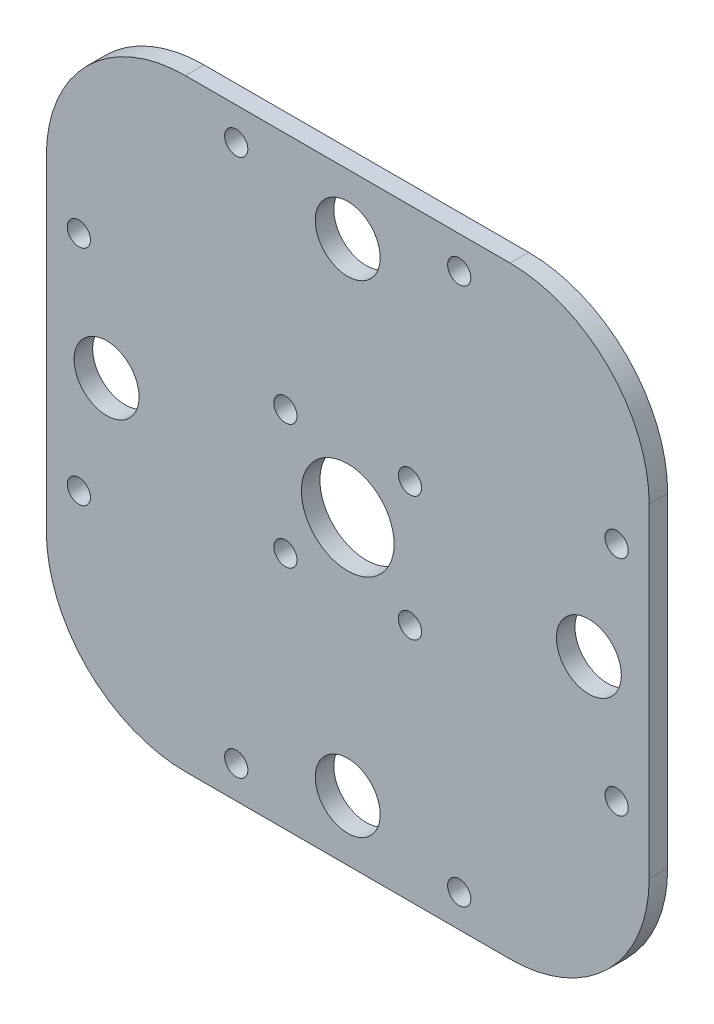
ISO-10303-21;
HEADER;
FILE_DESCRIPTION(('STEP AP214'),'2;1');
FILE_NAME('part.step','',(''),(''),'','','');
FILE_SCHEMA(('AUTOMOTIVE_DESIGN { 1 0 10303 214 1 1 1 1 }'));
ENDSEC;
DATA;
#1=APPLICATION_CONTEXT('core data for automotive mechanical design processes');
#2=APPLICATION_PROTOCOL_DEFINITION('international standard','automotive_design',2000,#1);
#3=PRODUCT_CONTEXT('',#1,'mechanical');
#4=PRODUCT('Part','Part','',(#3));
#5=PRODUCT_RELATED_PRODUCT_CATEGORY('part','',(#4));
#6=PRODUCT_DEFINITION_FORMATION('','',#4);
#7=PRODUCT_DEFINITION_CONTEXT('part definition',#1,'design');
#8=PRODUCT_DEFINITION('design','',#6,#7);
#9=PRODUCT_DEFINITION_SHAPE('','',#8);
#10=(LENGTH_UNIT() NAMED_UNIT(*) SI_UNIT(.MILLI.,.METRE.));
#11=(NAMED_UNIT(*) PLANE_ANGLE_UNIT() SI_UNIT($,.RADIAN.));
#12=(NAMED_UNIT(*) SI_UNIT($,.STERADIAN.) SOLID_ANGLE_UNIT());
#13=UNCERTAINTY_MEASURE_WITH_UNIT(LENGTH_MEASURE(1.E-05),#10,'distance_accuracy_value','');
#14=(GEOMETRIC_REPRESENTATION_CONTEXT(3) GLOBAL_UNCERTAINTY_ASSIGNED_CONTEXT((#13)) GLOBAL_UNIT_ASSIGNED_CONTEXT((#10,
#11,#12)) REPRESENTATION_CONTEXT('',''));
#15=CARTESIAN_POINT('',(0.,0.,0.));
#16=DIRECTION('',(0.,0.,1.));
#17=DIRECTION('',(1.,0.,0.));
#18=AXIS2_PLACEMENT_3D('',#15,#16,#17);
#19=CARTESIAN_POINT('',(0.,0.,2.));
#20=DIRECTION('',(0.,0.,-1.));
#21=DIRECTION('',(-1.,0.,0.));
#22=AXIS2_PLACEMENT_3D('',#19,#20,#21);
#23=PLANE('',#22);
#24=CARTESIAN_POINT('',(-12.0208152801713,28.9913780286485,2.));
#25=DIRECTION('',(0.,0.,1.));
#26=DIRECTION('',(-1.,0.,0.));
#27=AXIS2_PLACEMENT_3D('',#24,#25,#26);
#28=CIRCLE('',#27,1.25);
#29=CARTESIAN_POINT('',(-13.2708152801713,28.9913780286485,2.));
#30=VERTEX_POINT('',#29);
#31=EDGE_CURVE('E255',#30,#30,#28,.T.);
#32=ORIENTED_EDGE('',*,*,#31,.F.);
#33=EDGE_LOOP('',(#32));
#34=FACE_BOUND('',#33,.T.);
#35=CARTESIAN_POINT('',(12.0208152801708,28.9913780286496,2.));
#36=DIRECTION('',(0.,0.,1.));
#37=DIRECTION('',(1.,0.,0.));
#38=AXIS2_PLACEMENT_3D('',#35,#36,#37);
#39=CIRCLE('',#38,1.25);
#40=CARTESIAN_POINT('',(13.2708152801708,28.9913780286496,2.));
#41=VERTEX_POINT('',#40);
#42=EDGE_CURVE('E249',#41,#41,#39,.T.);
#43=ORIENTED_EDGE('',*,*,#42,.F.);
#44=EDGE_LOOP('',(#43));
#45=FACE_BOUND('',#44,.T.);
#46=CARTESIAN_POINT('',(28.991378028648,12.0208152801725,2.));
#47=DIRECTION('',(0.,0.,1.));
#48=DIRECTION('',(-1.,0.,0.));
#49=AXIS2_PLACEMENT_3D('',#46,#47,#48);
#50=CIRCLE('',#49,1.25);
#51=CARTESIAN_POINT('',(27.741378028648,12.0208152801725,2.));
#52=VERTEX_POINT('',#51);
#53=EDGE_CURVE('E243',#52,#52,#50,.T.);
#54=ORIENTED_EDGE('',*,*,#53,.F.);
#55=EDGE_LOOP('',(#54));
#56=FACE_BOUND('',#55,.T.);
#57=CARTESIAN_POINT('',(28.9913780286492,-12.0208152801697,2.));
#58=DIRECTION('',(0.,0.,1.));
#59=DIRECTION('',(1.,0.,0.));
#60=AXIS2_PLACEMENT_3D('',#57,#58,#59);
#61=CIRCLE('',#60,1.25);
#62=CARTESIAN_POINT('',(30.2413780286492,-12.0208152801697,2.));
#63=VERTEX_POINT('',#62);
#64=EDGE_CURVE('E236',#63,#63,#61,.T.);
#65=ORIENTED_EDGE('',*,*,#64,.F.);
#66=EDGE_LOOP('',(#65));
#67=FACE_BOUND('',#66,.T.);
#68=CARTESIAN_POINT('',(12.020815280172,-28.9913780286469,2.));
#69=DIRECTION('',(0.,0.,1.));
#70=DIRECTION('',(-1.,0.,0.));
#71=AXIS2_PLACEMENT_3D('',#68,#69,#70);
#72=CIRCLE('',#71,1.25);
#73=CARTESIAN_POINT('',(10.770815280172,-28.9913780286469,2.));
#74=VERTEX_POINT('',#73);
#75=EDGE_CURVE('E272',#74,#74,#72,.T.);
#76=ORIENTED_EDGE('',*,*,#75,.F.);
#77=EDGE_LOOP('',(#76));
#78=FACE_BOUND('',#77,.T.);
#79=CARTESIAN_POINT('',(-12.0208152801702,-28.991378028648,2.));
#80=DIRECTION('',(0.,0.,1.));
#81=DIRECTION('',(1.,0.,0.));
#82=AXIS2_PLACEMENT_3D('',#79,#80,#81);
#83=CIRCLE('',#82,1.25);
#84=CARTESIAN_POINT('',(-10.7708152801702,-28.991378028648,2.));
#85=VERTEX_POINT('',#84);
#86=EDGE_CURVE('E266',#85,#85,#83,.T.);
#87=ORIENTED_EDGE('',*,*,#86,.F.);
#88=EDGE_LOOP('',(#87));
#89=FACE_BOUND('',#88,.T.);
#90=CARTESIAN_POINT('',(-28.9913780286473,-12.0208152801708,2.));
#91=DIRECTION('',(0.,0.,1.));
#92=DIRECTION('',(-1.,0.,0.));
#93=AXIS2_PLACEMENT_3D('',#90,#91,#92);
#94=CIRCLE('',#93,1.25);
#95=CARTESIAN_POINT('',(-30.2413780286473,-12.0208152801708,2.));
#96=VERTEX_POINT('',#95);
#97=EDGE_CURVE('E260',#96,#96,#94,.T.);
#98=ORIENTED_EDGE('',*,*,#97,.F.);
#99=EDGE_LOOP('',(#98));
#100=FACE_BOUND('',#99,.T.);
#101=CARTESIAN_POINT('',(-28.9913780286485,12.0208152801713,2.));
#102=DIRECTION('',(0.,0.,1.));
#103=DIRECTION('',(1.,0.,0.));
#104=AXIS2_PLACEMENT_3D('',#101,#102,#103);
#105=CIRCLE('',#104,1.25);
#106=CARTESIAN_POINT('',(-27.7413780286485,12.0208152801713,2.));
#107=VERTEX_POINT('',#106);
#108=EDGE_CURVE('E230',#107,#107,#105,.T.);
#109=ORIENTED_EDGE('',*,*,#108,.F.);
#110=EDGE_LOOP('',(#109));
#111=FACE_BOUND('',#110,.T.);
#112=CARTESIAN_POINT('',(-26.,-5.56479514318364E-13,2.));
#113=DIRECTION('',(0.,0.,1.));
#114=DIRECTION('',(1.,0.,0.));
#115=AXIS2_PLACEMENT_3D('',#112,#113,#114);
#116=CIRCLE('',#115,3.5);
#117=CARTESIAN_POINT('',(-22.5,-5.56479514318364E-13,2.));
#118=VERTEX_POINT('',#117);
#119=EDGE_CURVE('E225',#118,#118,#116,.T.);
#120=ORIENTED_EDGE('',*,*,#119,.F.);
#121=EDGE_LOOP('',(#120));
#122=FACE_BOUND('',#121,.T.);
#123=CARTESIAN_POINT('',(-5.58071555157255E-13,26.,2.));
#124=DIRECTION('',(0.,0.,1.));
#125=DIRECTION('',(1.,0.,0.));
#126=AXIS2_PLACEMENT_3D('',#123,#124,#125);
#127=CIRCLE('',#126,3.5);
#128=CARTESIAN_POINT('',(3.49999999999944,26.,2.));
#129=VERTEX_POINT('',#128);
#130=EDGE_CURVE('E219',#129,#129,#127,.T.);
#131=ORIENTED_EDGE('',*,*,#130,.F.);
#132=EDGE_LOOP('',(#131));
#133=FACE_BOUND('',#132,.T.);
#134=CARTESIAN_POINT('',(26.,5.59663595996147E-13,2.));
#135=DIRECTION('',(0.,0.,1.));
#136=DIRECTION('',(1.,0.,0.));
#137=AXIS2_PLACEMENT_3D('',#134,#135,#136);
#138=CIRCLE('',#137,3.5);
#139=CARTESIAN_POINT('',(29.5,5.59663595996147E-13,2.));
#140=VERTEX_POINT('',#139);
#141=EDGE_CURVE('E213',#140,#140,#138,.T.);
#142=ORIENTED_EDGE('',*,*,#141,.F.);
#143=EDGE_LOOP('',(#142));
#144=FACE_BOUND('',#143,.T.);
#145=CARTESIAN_POINT('',(5.61255636835038E-13,-26.,2.));
#146=DIRECTION('',(0.,0.,1.));
#147=DIRECTION('',(1.,0.,0.));
#148=AXIS2_PLACEMENT_3D('',#145,#146,#147);
#149=CIRCLE('',#148,3.5);
#150=CARTESIAN_POINT('',(3.50000000000056,-26.,2.));
#151=VERTEX_POINT('',#150);
#152=EDGE_CURVE('E206',#151,#151,#149,.T.);
#153=ORIENTED_EDGE('',*,*,#152,.F.);
#154=EDGE_LOOP('',(#153));
#155=FACE_BOUND('',#154,.T.);
#156=DIRECTION('',(0.,1.,0.));
#157=VECTOR('',#156,1.);
#158=CARTESIAN_POINT('',(32.5,-32.5,2.));
#159=LINE('',#158,#157);
#160=CARTESIAN_POINT('',(32.5,-17.5,2.));
#161=VERTEX_POINT('',#160);
#162=CARTESIAN_POINT('',(32.5,17.5,2.));
#163=VERTEX_POINT('',#162);
#164=EDGE_CURVE('E136',#161,#163,#159,.T.);
#165=ORIENTED_EDGE('',*,*,#164,.T.);
#166=CARTESIAN_POINT('',(17.5,17.5,2.));
#167=DIRECTION('',(0.,0.,-1.));
#168=DIRECTION('',(-1.,0.,0.));
#169=AXIS2_PLACEMENT_3D('',#166,#167,#168);
#170=CIRCLE('',#169,15.);
#171=CARTESIAN_POINT('',(17.5,32.5,2.));
#172=VERTEX_POINT('',#171);
#173=EDGE_CURVE('E151',#163,#172,#170,.F.);
#174=ORIENTED_EDGE('',*,*,#173,.T.);
#175=DIRECTION('',(-1.,0.,0.));
#176=VECTOR('',#175,1.);
#177=CARTESIAN_POINT('',(-32.5,32.5,2.));
#178=LINE('',#177,#176);
#179=CARTESIAN_POINT('',(-17.5,32.5,2.));
#180=VERTEX_POINT('',#179);
#181=EDGE_CURVE('E118',#172,#180,#178,.T.);
#182=ORIENTED_EDGE('',*,*,#181,.T.);
#183=CARTESIAN_POINT('',(-17.5,17.5,2.));
#184=DIRECTION('',(0.,0.,-1.));
#185=DIRECTION('',(-1.,0.,0.));
#186=AXIS2_PLACEMENT_3D('',#183,#184,#185);
#187=CIRCLE('',#186,15.);
#188=CARTESIAN_POINT('',(-32.5,17.5,2.));
#189=VERTEX_POINT('',#188);
#190=EDGE_CURVE('E146',#180,#189,#187,.F.);
#191=ORIENTED_EDGE('',*,*,#190,.T.);
#192=DIRECTION('',(0.,-1.,0.));
#193=VECTOR('',#192,1.);
#194=CARTESIAN_POINT('',(-32.5,-32.5,2.));
#195=LINE('',#194,#193);
#196=CARTESIAN_POINT('',(-32.5,-17.5,2.));
#197=VERTEX_POINT('',#196);
#198=EDGE_CURVE('E162',#189,#197,#195,.T.);
#199=ORIENTED_EDGE('',*,*,#198,.T.);
#200=CARTESIAN_POINT('',(-17.5,-17.5,2.));
#201=DIRECTION('',(0.,0.,-1.));
#202=DIRECTION('',(-1.,0.,0.));
#203=AXIS2_PLACEMENT_3D('',#200,#201,#202);
#204=CIRCLE('',#203,15.);
#205=CARTESIAN_POINT('',(-17.5,-32.5,2.));
#206=VERTEX_POINT('',#205);
#207=EDGE_CURVE('E54',#197,#206,#204,.F.);
#208=ORIENTED_EDGE('',*,*,#207,.T.);
#209=DIRECTION('',(1.,0.,0.));
#210=VECTOR('',#209,1.);
#211=CARTESIAN_POINT('',(-32.5,-32.5,2.));
#212=LINE('',#211,#210);
#213=CARTESIAN_POINT('',(17.5,-32.5,2.));
#214=VERTEX_POINT('',#213);
#215=EDGE_CURVE('E137',#206,#214,#212,.T.);
#216=ORIENTED_EDGE('',*,*,#215,.T.);
#217=CARTESIAN_POINT('',(17.5,-17.5,2.));
#218=DIRECTION('',(0.,0.,-1.));
#219=DIRECTION('',(-1.,0.,0.));
#220=AXIS2_PLACEMENT_3D('',#217,#218,#219);
#221=CIRCLE('',#220,15.);
#222=EDGE_CURVE('E149',#214,#161,#221,.F.);
#223=ORIENTED_EDGE('',*,*,#222,.T.);
#224=EDGE_LOOP('',(#165,#174,#182,#191,#199,#208,#216,#223));
#225=FACE_BOUND('',#224,.T.);
#226=CARTESIAN_POINT('',(-6.7175144212722,6.7175144212722,2.));
#227=DIRECTION('',(0.,0.,1.));
#228=DIRECTION('',(1.,0.,0.));
#229=AXIS2_PLACEMENT_3D('',#226,#227,#228);
#230=CIRCLE('',#229,1.25);
#231=CARTESIAN_POINT('',(-5.4675144212722,6.7175144212722,2.));
#232=VERTEX_POINT('',#231);
#233=EDGE_CURVE('E131',#232,#232,#230,.T.);
#234=ORIENTED_EDGE('',*,*,#233,.F.);
#235=EDGE_LOOP('',(#234));
#236=FACE_BOUND('',#235,.T.);
#237=CARTESIAN_POINT('',(6.7175144212722,6.71751442127258,2.));
#238=DIRECTION('',(0.,0.,1.));
#239=DIRECTION('',(1.,0.,0.));
#240=AXIS2_PLACEMENT_3D('',#237,#238,#239);
#241=CIRCLE('',#240,1.25);
#242=CARTESIAN_POINT('',(7.9675144212722,6.71751442127258,2.));
#243=VERTEX_POINT('',#242);
#244=EDGE_CURVE('E179',#243,#243,#241,.T.);
#245=ORIENTED_EDGE('',*,*,#244,.F.);
#246=EDGE_LOOP('',(#245));
#247=FACE_BOUND('',#246,.T.);
#248=CARTESIAN_POINT('',(0.,0.,2.));
#249=DIRECTION('',(0.,0.,1.));
#250=DIRECTION('',(1.,0.,0.));
#251=AXIS2_PLACEMENT_3D('',#248,#249,#250);
#252=CIRCLE('',#251,5.);
#253=CARTESIAN_POINT('',(4.99999999999999,0.,2.));
#254=VERTEX_POINT('',#253);
#255=EDGE_CURVE('E185',#254,#254,#252,.T.);
#256=ORIENTED_EDGE('',*,*,#255,.F.);
#257=EDGE_LOOP('',(#256));
#258=FACE_BOUND('',#257,.T.);
#259=CARTESIAN_POINT('',(6.71751442127258,-6.71751442127182,2.));
#260=DIRECTION('',(0.,0.,1.));
#261=DIRECTION('',(1.,0.,0.));
#262=AXIS2_PLACEMENT_3D('',#259,#260,#261);
#263=CIRCLE('',#262,1.25);
#264=CARTESIAN_POINT('',(7.96751442127258,-6.71751442127182,2.));
#265=VERTEX_POINT('',#264);
#266=EDGE_CURVE('E191',#265,#265,#263,.T.);
#267=ORIENTED_EDGE('',*,*,#266,.F.);
#268=EDGE_LOOP('',(#267));
#269=FACE_BOUND('',#268,.T.);
#270=CARTESIAN_POINT('',(-6.71751442127182,-6.7175144212722,2.));
#271=DIRECTION('',(0.,0.,1.));
#272=DIRECTION('',(1.,0.,0.));
#273=AXIS2_PLACEMENT_3D('',#270,#271,#272);
#274=CIRCLE('',#273,1.25);
#275=CARTESIAN_POINT('',(-5.46751442127182,-6.7175144212722,2.));
#276=VERTEX_POINT('',#275);
#277=EDGE_CURVE('E197',#276,#276,#274,.T.);
#278=ORIENTED_EDGE('',*,*,#277,.F.);
#279=EDGE_LOOP('',(#278));
#280=FACE_BOUND('',#279,.T.);
#281=ADVANCED_FACE('F32',(#34,#45,#56,#67,#78,#89,#100,#111,#122,#133,#144,#155,#225,#236,#247,
#258,#269,#280),#23,.F.);
#282=CARTESIAN_POINT('',(0.,0.,0.));
#283=DIRECTION('',(0.,0.,-1.));
#284=DIRECTION('',(-1.,0.,0.));
#285=AXIS2_PLACEMENT_3D('',#282,#283,#284);
#286=PLANE('',#285);
#287=CARTESIAN_POINT('',(-12.0208152801713,28.9913780286485,0.));
#288=DIRECTION('',(0.,0.,1.));
#289=DIRECTION('',(-1.,0.,0.));
#290=AXIS2_PLACEMENT_3D('',#287,#288,#289);
#291=CIRCLE('',#290,1.25);
#292=CARTESIAN_POINT('',(-13.2708152801713,28.9913780286485,0.));
#293=VERTEX_POINT('',#292);
#294=EDGE_CURVE('E233',#293,#293,#291,.T.);
#295=ORIENTED_EDGE('',*,*,#294,.T.);
#296=EDGE_LOOP('',(#295));
#297=FACE_BOUND('',#296,.T.);
#298=CARTESIAN_POINT('',(12.0208152801708,28.9913780286496,0.));
#299=DIRECTION('',(0.,0.,1.));
#300=DIRECTION('',(1.,0.,0.));
#301=AXIS2_PLACEMENT_3D('',#298,#299,#300);
#302=CIRCLE('',#301,1.25);
#303=CARTESIAN_POINT('',(13.2708152801708,28.9913780286496,0.));
#304=VERTEX_POINT('',#303);
#305=EDGE_CURVE('E252',#304,#304,#302,.T.);
#306=ORIENTED_EDGE('',*,*,#305,.T.);
#307=EDGE_LOOP('',(#306));
#308=FACE_BOUND('',#307,.T.);
#309=CARTESIAN_POINT('',(28.991378028648,12.0208152801725,0.));
#310=DIRECTION('',(0.,0.,1.));
#311=DIRECTION('',(-1.,0.,0.));
#312=AXIS2_PLACEMENT_3D('',#309,#310,#311);
#313=CIRCLE('',#312,1.25);
#314=CARTESIAN_POINT('',(27.741378028648,12.0208152801725,0.));
#315=VERTEX_POINT('',#314);
#316=EDGE_CURVE('E246',#315,#315,#313,.T.);
#317=ORIENTED_EDGE('',*,*,#316,.T.);
#318=EDGE_LOOP('',(#317));
#319=FACE_BOUND('',#318,.T.);
#320=CARTESIAN_POINT('',(28.9913780286492,-12.0208152801697,0.));
#321=DIRECTION('',(0.,0.,1.));
#322=DIRECTION('',(1.,0.,0.));
#323=AXIS2_PLACEMENT_3D('',#320,#321,#322);
#324=CIRCLE('',#323,1.25);
#325=CARTESIAN_POINT('',(30.2413780286492,-12.0208152801697,0.));
#326=VERTEX_POINT('',#325);
#327=EDGE_CURVE('E239',#326,#326,#324,.T.);
#328=ORIENTED_EDGE('',*,*,#327,.T.);
#329=EDGE_LOOP('',(#328));
#330=FACE_BOUND('',#329,.T.);
#331=CARTESIAN_POINT('',(12.020815280172,-28.9913780286469,0.));
#332=DIRECTION('',(0.,0.,1.));
#333=DIRECTION('',(-1.,0.,0.));
#334=AXIS2_PLACEMENT_3D('',#331,#332,#333);
#335=CIRCLE('',#334,1.25);
#336=CARTESIAN_POINT('',(10.770815280172,-28.9913780286469,0.));
#337=VERTEX_POINT('',#336);
#338=EDGE_CURVE('E240',#337,#337,#335,.T.);
#339=ORIENTED_EDGE('',*,*,#338,.T.);
#340=EDGE_LOOP('',(#339));
#341=FACE_BOUND('',#340,.T.);
#342=CARTESIAN_POINT('',(-12.0208152801702,-28.991378028648,0.));
#343=DIRECTION('',(0.,0.,1.));
#344=DIRECTION('',(1.,0.,0.));
#345=AXIS2_PLACEMENT_3D('',#342,#343,#344);
#346=CIRCLE('',#345,1.25);
#347=CARTESIAN_POINT('',(-10.7708152801702,-28.991378028648,0.));
#348=VERTEX_POINT('',#347);
#349=EDGE_CURVE('E269',#348,#348,#346,.T.);
#350=ORIENTED_EDGE('',*,*,#349,.T.);
#351=EDGE_LOOP('',(#350));
#352=FACE_BOUND('',#351,.T.);
#353=CARTESIAN_POINT('',(-28.9913780286473,-12.0208152801708,0.));
#354=DIRECTION('',(0.,0.,1.));
#355=DIRECTION('',(-1.,0.,0.));
#356=AXIS2_PLACEMENT_3D('',#353,#354,#355);
#357=CIRCLE('',#356,1.25);
#358=CARTESIAN_POINT('',(-30.2413780286473,-12.0208152801708,0.));
#359=VERTEX_POINT('',#358);
#360=EDGE_CURVE('E263',#359,#359,#357,.T.);
#361=ORIENTED_EDGE('',*,*,#360,.T.);
#362=EDGE_LOOP('',(#361));
#363=FACE_BOUND('',#362,.T.);
#364=CARTESIAN_POINT('',(-28.9913780286485,12.0208152801713,0.));
#365=DIRECTION('',(0.,0.,1.));
#366=DIRECTION('',(1.,0.,0.));
#367=AXIS2_PLACEMENT_3D('',#364,#365,#366);
#368=CIRCLE('',#367,1.25);
#369=CARTESIAN_POINT('',(-27.7413780286485,12.0208152801713,0.));
#370=VERTEX_POINT('',#369);
#371=EDGE_CURVE('E210',#370,#370,#368,.T.);
#372=ORIENTED_EDGE('',*,*,#371,.T.);
#373=EDGE_LOOP('',(#372));
#374=FACE_BOUND('',#373,.T.);
#375=CARTESIAN_POINT('',(-26.,-5.56479514318364E-13,0.));
#376=DIRECTION('',(0.,0.,1.));
#377=DIRECTION('',(1.,0.,0.));
#378=AXIS2_PLACEMENT_3D('',#375,#376,#377);
#379=CIRCLE('',#378,3.5);
#380=CARTESIAN_POINT('',(-22.5,-5.56479514318364E-13,0.));
#381=VERTEX_POINT('',#380);
#382=EDGE_CURVE('E203',#381,#381,#379,.T.);
#383=ORIENTED_EDGE('',*,*,#382,.T.);
#384=EDGE_LOOP('',(#383));
#385=FACE_BOUND('',#384,.T.);
#386=CARTESIAN_POINT('',(-5.58071555157255E-13,26.,0.));
#387=DIRECTION('',(0.,0.,1.));
#388=DIRECTION('',(1.,0.,0.));
#389=AXIS2_PLACEMENT_3D('',#386,#387,#388);
#390=CIRCLE('',#389,3.5);
#391=CARTESIAN_POINT('',(3.49999999999944,26.,0.));
#392=VERTEX_POINT('',#391);
#393=EDGE_CURVE('E222',#392,#392,#390,.T.);
#394=ORIENTED_EDGE('',*,*,#393,.T.);
#395=EDGE_LOOP('',(#394));
#396=FACE_BOUND('',#395,.T.);
#397=CARTESIAN_POINT('',(26.,5.59663595996147E-13,0.));
#398=DIRECTION('',(0.,0.,1.));
#399=DIRECTION('',(1.,0.,0.));
#400=AXIS2_PLACEMENT_3D('',#397,#398,#399);
#401=CIRCLE('',#400,3.5);
#402=CARTESIAN_POINT('',(29.5,5.59663595996147E-13,0.));
#403=VERTEX_POINT('',#402);
#404=EDGE_CURVE('E216',#403,#403,#401,.T.);
#405=ORIENTED_EDGE('',*,*,#404,.T.);
#406=EDGE_LOOP('',(#405));
#407=FACE_BOUND('',#406,.T.);
#408=CARTESIAN_POINT('',(5.61255636835038E-13,-26.,0.));
#409=DIRECTION('',(0.,0.,1.));
#410=DIRECTION('',(1.,0.,0.));
#411=AXIS2_PLACEMENT_3D('',#408,#409,#410);
#412=CIRCLE('',#411,3.5);
#413=CARTESIAN_POINT('',(3.50000000000056,-26.,0.));
#414=VERTEX_POINT('',#413);
#415=EDGE_CURVE('E209',#414,#414,#412,.T.);
#416=ORIENTED_EDGE('',*,*,#415,.T.);
#417=EDGE_LOOP('',(#416));
#418=FACE_BOUND('',#417,.T.);
#419=CARTESIAN_POINT('',(6.71751442127258,-6.71751442127182,0.));
#420=DIRECTION('',(0.,0.,1.));
#421=DIRECTION('',(1.,0.,0.));
#422=AXIS2_PLACEMENT_3D('',#419,#420,#421);
#423=CIRCLE('',#422,1.25);
#424=CARTESIAN_POINT('',(7.96751442127258,-6.71751442127182,0.));
#425=VERTEX_POINT('',#424);
#426=EDGE_CURVE('E194',#425,#425,#423,.T.);
#427=ORIENTED_EDGE('',*,*,#426,.T.);
#428=EDGE_LOOP('',(#427));
#429=FACE_BOUND('',#428,.T.);
#430=CARTESIAN_POINT('',(6.7175144212722,6.71751442127258,0.));
#431=DIRECTION('',(0.,0.,1.));
#432=DIRECTION('',(1.,0.,0.));
#433=AXIS2_PLACEMENT_3D('',#430,#431,#432);
#434=CIRCLE('',#433,1.25);
#435=CARTESIAN_POINT('',(7.9675144212722,6.71751442127258,0.));
#436=VERTEX_POINT('',#435);
#437=EDGE_CURVE('E182',#436,#436,#434,.T.);
#438=ORIENTED_EDGE('',*,*,#437,.T.);
#439=EDGE_LOOP('',(#438));
#440=FACE_BOUND('',#439,.T.);
#441=DIRECTION('',(-1.,0.,0.));
#442=VECTOR('',#441,1.);
#443=CARTESIAN_POINT('',(-32.5,32.5,0.));
#444=LINE('',#443,#442);
#445=CARTESIAN_POINT('',(17.5,32.5,0.));
#446=VERTEX_POINT('',#445);
#447=CARTESIAN_POINT('',(-17.5,32.5,0.));
#448=VERTEX_POINT('',#447);
#449=EDGE_CURVE('E115',#446,#448,#444,.T.);
#450=ORIENTED_EDGE('',*,*,#449,.F.);
#451=CARTESIAN_POINT('',(17.5,17.5,0.));
#452=DIRECTION('',(0.,0.,-1.));
#453=DIRECTION('',(-1.,0.,0.));
#454=AXIS2_PLACEMENT_3D('',#451,#452,#453);
#455=CIRCLE('',#454,15.);
#456=CARTESIAN_POINT('',(32.5,17.5,0.));
#457=VERTEX_POINT('',#456);
#458=EDGE_CURVE('E98',#446,#457,#455,.T.);
#459=ORIENTED_EDGE('',*,*,#458,.T.);
#460=DIRECTION('',(0.,1.,0.));
#461=VECTOR('',#460,1.);
#462=CARTESIAN_POINT('',(32.5,-32.5,0.));
#463=LINE('',#462,#461);
#464=CARTESIAN_POINT('',(32.5,-17.5,0.));
#465=VERTEX_POINT('',#464);
#466=EDGE_CURVE('E126',#465,#457,#463,.T.);
#467=ORIENTED_EDGE('',*,*,#466,.F.);
#468=CARTESIAN_POINT('',(17.5,-17.5,0.));
#469=DIRECTION('',(0.,0.,-1.));
#470=DIRECTION('',(-1.,0.,0.));
#471=AXIS2_PLACEMENT_3D('',#468,#469,#470);
#472=CIRCLE('',#471,15.);
#473=CARTESIAN_POINT('',(17.5,-32.5,0.));
#474=VERTEX_POINT('',#473);
#475=EDGE_CURVE('E109',#465,#474,#472,.T.);
#476=ORIENTED_EDGE('',*,*,#475,.T.);
#477=DIRECTION('',(1.,0.,0.));
#478=VECTOR('',#477,1.);
#479=CARTESIAN_POINT('',(-32.5,-32.5,0.));
#480=LINE('',#479,#478);
#481=CARTESIAN_POINT('',(-17.5,-32.5,0.));
#482=VERTEX_POINT('',#481);
#483=EDGE_CURVE('E129',#482,#474,#480,.T.);
#484=ORIENTED_EDGE('',*,*,#483,.F.);
#485=CARTESIAN_POINT('',(-17.5,-17.5,0.));
#486=DIRECTION('',(0.,0.,-1.));
#487=DIRECTION('',(-1.,0.,0.));
#488=AXIS2_PLACEMENT_3D('',#485,#486,#487);
#489=CIRCLE('',#488,15.);
#490=CARTESIAN_POINT('',(-32.5,-17.5,0.));
#491=VERTEX_POINT('',#490);
#492=EDGE_CURVE('E140',#482,#491,#489,.T.);
#493=ORIENTED_EDGE('',*,*,#492,.T.);
#494=DIRECTION('',(0.,-1.,0.));
#495=VECTOR('',#494,1.);
#496=CARTESIAN_POINT('',(-32.5,-32.5,0.));
#497=LINE('',#496,#495);
#498=CARTESIAN_POINT('',(-32.5,17.5,0.));
#499=VERTEX_POINT('',#498);
#500=EDGE_CURVE('E125',#499,#491,#497,.T.);
#501=ORIENTED_EDGE('',*,*,#500,.F.);
#502=CARTESIAN_POINT('',(-17.5,17.5,0.));
#503=DIRECTION('',(0.,0.,-1.));
#504=DIRECTION('',(-1.,0.,0.));
#505=AXIS2_PLACEMENT_3D('',#502,#503,#504);
#506=CIRCLE('',#505,15.);
#507=EDGE_CURVE('E119',#499,#448,#506,.T.);
#508=ORIENTED_EDGE('',*,*,#507,.T.);
#509=EDGE_LOOP('',(#450,#459,#467,#476,#484,#493,#501,#508));
#510=FACE_BOUND('',#509,.T.);
#511=CARTESIAN_POINT('',(-6.7175144212722,6.7175144212722,0.));
#512=DIRECTION('',(0.,0.,1.));
#513=DIRECTION('',(1.,0.,0.));
#514=AXIS2_PLACEMENT_3D('',#511,#512,#513);
#515=CIRCLE('',#514,1.25);
#516=CARTESIAN_POINT('',(-5.4675144212722,6.7175144212722,0.));
#517=VERTEX_POINT('',#516);
#518=EDGE_CURVE('E176',#517,#517,#515,.T.);
#519=ORIENTED_EDGE('',*,*,#518,.T.);
#520=EDGE_LOOP('',(#519));
#521=FACE_BOUND('',#520,.T.);
#522=CARTESIAN_POINT('',(0.,0.,0.));
#523=DIRECTION('',(0.,0.,1.));
#524=DIRECTION('',(1.,0.,0.));
#525=AXIS2_PLACEMENT_3D('',#522,#523,#524);
#526=CIRCLE('',#525,5.);
#527=CARTESIAN_POINT('',(4.99999999999999,0.,0.));
#528=VERTEX_POINT('',#527);
#529=EDGE_CURVE('E188',#528,#528,#526,.T.);
#530=ORIENTED_EDGE('',*,*,#529,.T.);
#531=EDGE_LOOP('',(#530));
#532=FACE_BOUND('',#531,.T.);
#533=CARTESIAN_POINT('',(-6.71751442127182,-6.7175144212722,0.));
#534=DIRECTION('',(0.,0.,1.));
#535=DIRECTION('',(1.,0.,0.));
#536=AXIS2_PLACEMENT_3D('',#533,#534,#535);
#537=CIRCLE('',#536,1.25);
#538=CARTESIAN_POINT('',(-5.46751442127182,-6.7175144212722,0.));
#539=VERTEX_POINT('',#538);
#540=EDGE_CURVE('E200',#539,#539,#537,.T.);
#541=ORIENTED_EDGE('',*,*,#540,.T.);
#542=EDGE_LOOP('',(#541));
#543=FACE_BOUND('',#542,.T.);
#544=ADVANCED_FACE('F122',(#297,#308,#319,#330,#341,#352,#363,#374,#385,#396,#407,#418,#429,
#440,#510,#521,#532,#543),#286,.T.);
#545=CARTESIAN_POINT('',(32.5,-32.5,2.));
#546=DIRECTION('',(-1.,0.,0.));
#547=DIRECTION('',(0.,0.,1.));
#548=AXIS2_PLACEMENT_3D('',#545,#546,#547);
#549=PLANE('',#548);
#550=ORIENTED_EDGE('',*,*,#466,.T.);
#551=DIRECTION('',(0.,0.,-1.));
#552=VECTOR('',#551,1.);
#553=CARTESIAN_POINT('',(32.5,17.5,2.));
#554=LINE('',#553,#552);
#555=EDGE_CURVE('E103',#457,#163,#554,.F.);
#556=ORIENTED_EDGE('',*,*,#555,.T.);
#557=ORIENTED_EDGE('',*,*,#164,.F.);
#558=DIRECTION('',(0.,0.,-1.));
#559=VECTOR('',#558,1.);
#560=CARTESIAN_POINT('',(32.5,-17.5,2.));
#561=LINE('',#560,#559);
#562=EDGE_CURVE('E108',#161,#465,#561,.T.);
#563=ORIENTED_EDGE('',*,*,#562,.T.);
#564=EDGE_LOOP('',(#550,#556,#557,#563));
#565=FACE_BOUND('',#564,.T.);
#566=ADVANCED_FACE('F325',(#565),#549,.F.);
#567=CARTESIAN_POINT('',(-32.5,32.5,2.));
#568=DIRECTION('',(0.,-1.,0.));
#569=DIRECTION('',(0.,0.,-1.));
#570=AXIS2_PLACEMENT_3D('',#567,#568,#569);
#571=PLANE('',#570);
#572=ORIENTED_EDGE('',*,*,#181,.F.);
#573=DIRECTION('',(0.,0.,-1.));
#574=VECTOR('',#573,1.);
#575=CARTESIAN_POINT('',(17.5,32.5,2.));
#576=LINE('',#575,#574);
#577=EDGE_CURVE('E102',#172,#446,#576,.T.);
#578=ORIENTED_EDGE('',*,*,#577,.T.);
#579=ORIENTED_EDGE('',*,*,#449,.T.);
#580=DIRECTION('',(0.,0.,-1.));
#581=VECTOR('',#580,1.);
#582=CARTESIAN_POINT('',(-17.5,32.5,2.));
#583=LINE('',#582,#581);
#584=EDGE_CURVE('E120',#448,#180,#583,.F.);
#585=ORIENTED_EDGE('',*,*,#584,.T.);
#586=EDGE_LOOP('',(#572,#578,#579,#585));
#587=FACE_BOUND('',#586,.T.);
#588=ADVANCED_FACE('F114',(#587),#571,.F.);
#589=CARTESIAN_POINT('',(-32.5,-32.5,2.));
#590=DIRECTION('',(1.,0.,0.));
#591=DIRECTION('',(0.,0.,-1.));
#592=AXIS2_PLACEMENT_3D('',#589,#590,#591);
#593=PLANE('',#592);
#594=ORIENTED_EDGE('',*,*,#500,.T.);
#595=DIRECTION('',(0.,0.,-1.));
#596=VECTOR('',#595,1.);
#597=CARTESIAN_POINT('',(-32.5,-17.5,2.));
#598=LINE('',#597,#596);
#599=EDGE_CURVE('E11',#491,#197,#598,.F.);
#600=ORIENTED_EDGE('',*,*,#599,.T.);
#601=ORIENTED_EDGE('',*,*,#198,.F.);
#602=DIRECTION('',(0.,0.,-1.));
#603=VECTOR('',#602,1.);
#604=CARTESIAN_POINT('',(-32.5,17.5,2.));
#605=LINE('',#604,#603);
#606=EDGE_CURVE('E40',#189,#499,#605,.T.);
#607=ORIENTED_EDGE('',*,*,#606,.T.);
#608=EDGE_LOOP('',(#594,#600,#601,#607));
#609=FACE_BOUND('',#608,.T.);
#610=ADVANCED_FACE('F160',(#609),#593,.F.);
#611=CARTESIAN_POINT('',(-32.5,-32.5,2.));
#612=DIRECTION('',(0.,1.,0.));
#613=DIRECTION('',(0.,0.,1.));
#614=AXIS2_PLACEMENT_3D('',#611,#612,#613);
#615=PLANE('',#614);
#616=ORIENTED_EDGE('',*,*,#483,.T.);
#617=DIRECTION('',(0.,0.,-1.));
#618=VECTOR('',#617,1.);
#619=CARTESIAN_POINT('',(17.5,-32.5,2.));
#620=LINE('',#619,#618);
#621=EDGE_CURVE('E47',#474,#214,#620,.F.);
#622=ORIENTED_EDGE('',*,*,#621,.T.);
#623=ORIENTED_EDGE('',*,*,#215,.F.);
#624=DIRECTION('',(0.,0.,-1.));
#625=VECTOR('',#624,1.);
#626=CARTESIAN_POINT('',(-17.5,-32.5,2.));
#627=LINE('',#626,#625);
#628=EDGE_CURVE('E153',#206,#482,#627,.T.);
#629=ORIENTED_EDGE('',*,*,#628,.T.);
#630=EDGE_LOOP('',(#616,#622,#623,#629));
#631=FACE_BOUND('',#630,.T.);
#632=ADVANCED_FACE('F169',(#631),#615,.F.);
#633=CARTESIAN_POINT('',(-6.7175144212722,6.7175144212722,2.));
#634=DIRECTION('',(0.,0.,-1.));
#635=DIRECTION('',(-1.,0.,0.));
#636=AXIS2_PLACEMENT_3D('',#633,#634,#635);
#637=CYLINDRICAL_SURFACE('',#636,1.25);
#638=ORIENTED_EDGE('',*,*,#233,.T.);
#639=EDGE_LOOP('',(#638));
#640=FACE_BOUND('',#639,.T.);
#641=ORIENTED_EDGE('',*,*,#518,.F.);
#642=EDGE_LOOP('',(#641));
#643=FACE_BOUND('',#642,.T.);
#644=ADVANCED_FACE('F338',(#640,#643),#637,.F.);
#645=CARTESIAN_POINT('',(6.7175144212722,6.71751442127258,2.));
#646=DIRECTION('',(0.,0.,-1.));
#647=DIRECTION('',(-1.,0.,0.));
#648=AXIS2_PLACEMENT_3D('',#645,#646,#647);
#649=CYLINDRICAL_SURFACE('',#648,1.25);
#650=ORIENTED_EDGE('',*,*,#244,.T.);
#651=EDGE_LOOP('',(#650));
#652=FACE_BOUND('',#651,.T.);
#653=ORIENTED_EDGE('',*,*,#437,.F.);
#654=EDGE_LOOP('',(#653));
#655=FACE_BOUND('',#654,.T.);
#656=ADVANCED_FACE('F375',(#652,#655),#649,.F.);
#657=CARTESIAN_POINT('',(0.,0.,2.));
#658=DIRECTION('',(0.,0.,-1.));
#659=DIRECTION('',(-1.,0.,0.));
#660=AXIS2_PLACEMENT_3D('',#657,#658,#659);
#661=CYLINDRICAL_SURFACE('',#660,5.);
#662=ORIENTED_EDGE('',*,*,#255,.T.);
#663=EDGE_LOOP('',(#662));
#664=FACE_BOUND('',#663,.T.);
#665=ORIENTED_EDGE('',*,*,#529,.F.);
#666=EDGE_LOOP('',(#665));
#667=FACE_BOUND('',#666,.T.);
#668=ADVANCED_FACE('F371',(#664,#667),#661,.F.);
#669=CARTESIAN_POINT('',(6.71751442127258,-6.71751442127182,2.));
#670=DIRECTION('',(0.,0.,-1.));
#671=DIRECTION('',(-1.,0.,0.));
#672=AXIS2_PLACEMENT_3D('',#669,#670,#671);
#673=CYLINDRICAL_SURFACE('',#672,1.25);
#674=ORIENTED_EDGE('',*,*,#266,.T.);
#675=EDGE_LOOP('',(#674));
#676=FACE_BOUND('',#675,.T.);
#677=ORIENTED_EDGE('',*,*,#426,.F.);
#678=EDGE_LOOP('',(#677));
#679=FACE_BOUND('',#678,.T.);
#680=ADVANCED_FACE('F320',(#676,#679),#673,.F.);
#681=CARTESIAN_POINT('',(-6.71751442127182,-6.7175144212722,2.));
#682=DIRECTION('',(0.,0.,-1.));
#683=DIRECTION('',(-1.,0.,0.));
#684=AXIS2_PLACEMENT_3D('',#681,#682,#683);
#685=CYLINDRICAL_SURFACE('',#684,1.25);
#686=ORIENTED_EDGE('',*,*,#277,.T.);
#687=EDGE_LOOP('',(#686));
#688=FACE_BOUND('',#687,.T.);
#689=ORIENTED_EDGE('',*,*,#540,.F.);
#690=EDGE_LOOP('',(#689));
#691=FACE_BOUND('',#690,.T.);
#692=ADVANCED_FACE('F317',(#688,#691),#685,.F.);
#693=CARTESIAN_POINT('',(17.5,17.5,2.));
#694=DIRECTION('',(0.,0.,-1.));
#695=DIRECTION('',(-1.,0.,0.));
#696=AXIS2_PLACEMENT_3D('',#693,#694,#695);
#697=CYLINDRICAL_SURFACE('',#696,15.);
#698=ORIENTED_EDGE('',*,*,#173,.F.);
#699=ORIENTED_EDGE('',*,*,#555,.F.);
#700=ORIENTED_EDGE('',*,*,#458,.F.);
#701=ORIENTED_EDGE('',*,*,#577,.F.);
#702=EDGE_LOOP('',(#698,#699,#700,#701));
#703=FACE_BOUND('',#702,.T.);
#704=ADVANCED_FACE('F101',(#703),#697,.T.);
#705=CARTESIAN_POINT('',(17.5,-17.5,2.));
#706=DIRECTION('',(0.,0.,-1.));
#707=DIRECTION('',(-1.,0.,0.));
#708=AXIS2_PLACEMENT_3D('',#705,#706,#707);
#709=CYLINDRICAL_SURFACE('',#708,15.);
#710=ORIENTED_EDGE('',*,*,#222,.F.);
#711=ORIENTED_EDGE('',*,*,#621,.F.);
#712=ORIENTED_EDGE('',*,*,#475,.F.);
#713=ORIENTED_EDGE('',*,*,#562,.F.);
#714=EDGE_LOOP('',(#710,#711,#712,#713));
#715=FACE_BOUND('',#714,.T.);
#716=ADVANCED_FACE('F345',(#715),#709,.T.);
#717=CARTESIAN_POINT('',(-17.5,-17.5,2.));
#718=DIRECTION('',(0.,0.,-1.));
#719=DIRECTION('',(-1.,0.,0.));
#720=AXIS2_PLACEMENT_3D('',#717,#718,#719);
#721=CYLINDRICAL_SURFACE('',#720,15.);
#722=ORIENTED_EDGE('',*,*,#207,.F.);
#723=ORIENTED_EDGE('',*,*,#599,.F.);
#724=ORIENTED_EDGE('',*,*,#492,.F.);
#725=ORIENTED_EDGE('',*,*,#628,.F.);
#726=EDGE_LOOP('',(#722,#723,#724,#725));
#727=FACE_BOUND('',#726,.T.);
#728=ADVANCED_FACE('F168',(#727),#721,.T.);
#729=CARTESIAN_POINT('',(-17.5,17.5,2.));
#730=DIRECTION('',(0.,0.,-1.));
#731=DIRECTION('',(-1.,0.,0.));
#732=AXIS2_PLACEMENT_3D('',#729,#730,#731);
#733=CYLINDRICAL_SURFACE('',#732,15.);
#734=ORIENTED_EDGE('',*,*,#190,.F.);
#735=ORIENTED_EDGE('',*,*,#584,.F.);
#736=ORIENTED_EDGE('',*,*,#507,.F.);
#737=ORIENTED_EDGE('',*,*,#606,.F.);
#738=EDGE_LOOP('',(#734,#735,#736,#737));
#739=FACE_BOUND('',#738,.T.);
#740=ADVANCED_FACE('F34',(#739),#733,.T.);
#741=CARTESIAN_POINT('',(5.61255636835038E-13,-26.,0.));
#742=DIRECTION('',(0.,0.,1.));
#743=DIRECTION('',(1.,0.,0.));
#744=AXIS2_PLACEMENT_3D('',#741,#742,#743);
#745=CYLINDRICAL_SURFACE('',#744,3.5);
#746=ORIENTED_EDGE('',*,*,#415,.F.);
#747=EDGE_LOOP('',(#746));
#748=FACE_BOUND('',#747,.T.);
#749=ORIENTED_EDGE('',*,*,#152,.T.);
#750=EDGE_LOOP('',(#749));
#751=FACE_BOUND('',#750,.T.);
#752=ADVANCED_FACE('F352',(#748,#751),#745,.F.);
#753=CARTESIAN_POINT('',(26.,5.59663595996147E-13,0.));
#754=DIRECTION('',(0.,0.,1.));
#755=DIRECTION('',(1.,0.,0.));
#756=AXIS2_PLACEMENT_3D('',#753,#754,#755);
#757=CYLINDRICAL_SURFACE('',#756,3.5);
#758=ORIENTED_EDGE('',*,*,#404,.F.);
#759=EDGE_LOOP('',(#758));
#760=FACE_BOUND('',#759,.T.);
#761=ORIENTED_EDGE('',*,*,#141,.T.);
#762=EDGE_LOOP('',(#761));
#763=FACE_BOUND('',#762,.T.);
#764=ADVANCED_FACE('F356',(#760,#763),#757,.F.);
#765=CARTESIAN_POINT('',(-5.58071555157255E-13,26.,0.));
#766=DIRECTION('',(0.,0.,1.));
#767=DIRECTION('',(1.,0.,0.));
#768=AXIS2_PLACEMENT_3D('',#765,#766,#767);
#769=CYLINDRICAL_SURFACE('',#768,3.5);
#770=ORIENTED_EDGE('',*,*,#393,.F.);
#771=EDGE_LOOP('',(#770));
#772=FACE_BOUND('',#771,.T.);
#773=ORIENTED_EDGE('',*,*,#130,.T.);
#774=EDGE_LOOP('',(#773));
#775=FACE_BOUND('',#774,.T.);
#776=ADVANCED_FACE('F362',(#772,#775),#769,.F.);
#777=CARTESIAN_POINT('',(-26.,-5.56479514318364E-13,0.));
#778=DIRECTION('',(0.,0.,1.));
#779=DIRECTION('',(1.,0.,0.));
#780=AXIS2_PLACEMENT_3D('',#777,#778,#779);
#781=CYLINDRICAL_SURFACE('',#780,3.5);
#782=ORIENTED_EDGE('',*,*,#382,.F.);
#783=EDGE_LOOP('',(#782));
#784=FACE_BOUND('',#783,.T.);
#785=ORIENTED_EDGE('',*,*,#119,.T.);
#786=EDGE_LOOP('',(#785));
#787=FACE_BOUND('',#786,.T.);
#788=ADVANCED_FACE('F442',(#784,#787),#781,.F.);
#789=CARTESIAN_POINT('',(-28.9913780286485,12.0208152801713,0.));
#790=DIRECTION('',(0.,0.,1.));
#791=DIRECTION('',(1.,0.,0.));
#792=AXIS2_PLACEMENT_3D('',#789,#790,#791);
#793=CYLINDRICAL_SURFACE('',#792,1.25);
#794=ORIENTED_EDGE('',*,*,#371,.F.);
#795=EDGE_LOOP('',(#794));
#796=FACE_BOUND('',#795,.T.);
#797=ORIENTED_EDGE('',*,*,#108,.T.);
#798=EDGE_LOOP('',(#797));
#799=FACE_BOUND('',#798,.T.);
#800=ADVANCED_FACE('F451',(#796,#799),#793,.F.);
#801=CARTESIAN_POINT('',(-28.9913780286473,-12.0208152801708,0.));
#802=DIRECTION('',(0.,0.,1.));
#803=DIRECTION('',(1.,0.,0.));
#804=AXIS2_PLACEMENT_3D('',#801,#802,#803);
#805=CYLINDRICAL_SURFACE('',#804,1.25);
#806=ORIENTED_EDGE('',*,*,#360,.F.);
#807=EDGE_LOOP('',(#806));
#808=FACE_BOUND('',#807,.T.);
#809=ORIENTED_EDGE('',*,*,#97,.T.);
#810=EDGE_LOOP('',(#809));
#811=FACE_BOUND('',#810,.T.);
#812=ADVANCED_FACE('F472',(#808,#811),#805,.F.);
#813=CARTESIAN_POINT('',(-12.0208152801702,-28.991378028648,0.));
#814=DIRECTION('',(0.,0.,1.));
#815=DIRECTION('',(1.,0.,0.));
#816=AXIS2_PLACEMENT_3D('',#813,#814,#815);
#817=CYLINDRICAL_SURFACE('',#816,1.25);
#818=ORIENTED_EDGE('',*,*,#349,.F.);
#819=EDGE_LOOP('',(#818));
#820=FACE_BOUND('',#819,.T.);
#821=ORIENTED_EDGE('',*,*,#86,.T.);
#822=EDGE_LOOP('',(#821));
#823=FACE_BOUND('',#822,.T.);
#824=ADVANCED_FACE('F284',(#820,#823),#817,.F.);
#825=CARTESIAN_POINT('',(12.020815280172,-28.9913780286469,0.));
#826=DIRECTION('',(0.,0.,1.));
#827=DIRECTION('',(1.,0.,0.));
#828=AXIS2_PLACEMENT_3D('',#825,#826,#827);
#829=CYLINDRICAL_SURFACE('',#828,1.25);
#830=ORIENTED_EDGE('',*,*,#338,.F.);
#831=EDGE_LOOP('',(#830));
#832=FACE_BOUND('',#831,.T.);
#833=ORIENTED_EDGE('',*,*,#75,.T.);
#834=EDGE_LOOP('',(#833));
#835=FACE_BOUND('',#834,.T.);
#836=ADVANCED_FACE('F280',(#832,#835),#829,.F.);
#837=CARTESIAN_POINT('',(28.9913780286492,-12.0208152801697,0.));
#838=DIRECTION('',(0.,0.,1.));
#839=DIRECTION('',(1.,0.,0.));
#840=AXIS2_PLACEMENT_3D('',#837,#838,#839);
#841=CYLINDRICAL_SURFACE('',#840,1.25);
#842=ORIENTED_EDGE('',*,*,#327,.F.);
#843=EDGE_LOOP('',(#842));
#844=FACE_BOUND('',#843,.T.);
#845=ORIENTED_EDGE('',*,*,#64,.T.);
#846=EDGE_LOOP('',(#845));
#847=FACE_BOUND('',#846,.T.);
#848=ADVANCED_FACE('F283',(#844,#847),#841,.F.);
#849=CARTESIAN_POINT('',(28.991378028648,12.0208152801725,0.));
#850=DIRECTION('',(0.,0.,1.));
#851=DIRECTION('',(1.,0.,0.));
#852=AXIS2_PLACEMENT_3D('',#849,#850,#851);
#853=CYLINDRICAL_SURFACE('',#852,1.25);
#854=ORIENTED_EDGE('',*,*,#316,.F.);
#855=EDGE_LOOP('',(#854));
#856=FACE_BOUND('',#855,.T.);
#857=ORIENTED_EDGE('',*,*,#53,.T.);
#858=EDGE_LOOP('',(#857));
#859=FACE_BOUND('',#858,.T.);
#860=ADVANCED_FACE('F506',(#856,#859),#853,.F.);
#861=CARTESIAN_POINT('',(12.0208152801708,28.9913780286496,0.));
#862=DIRECTION('',(0.,0.,1.));
#863=DIRECTION('',(1.,0.,0.));
#864=AXIS2_PLACEMENT_3D('',#861,#862,#863);
#865=CYLINDRICAL_SURFACE('',#864,1.25);
#866=ORIENTED_EDGE('',*,*,#305,.F.);
#867=EDGE_LOOP('',(#866));
#868=FACE_BOUND('',#867,.T.);
#869=ORIENTED_EDGE('',*,*,#42,.T.);
#870=EDGE_LOOP('',(#869));
#871=FACE_BOUND('',#870,.T.);
#872=ADVANCED_FACE('F516',(#868,#871),#865,.F.);
#873=CARTESIAN_POINT('',(-12.0208152801713,28.9913780286485,0.));
#874=DIRECTION('',(0.,0.,1.));
#875=DIRECTION('',(1.,0.,0.));
#876=AXIS2_PLACEMENT_3D('',#873,#874,#875);
#877=CYLINDRICAL_SURFACE('',#876,1.25);
#878=ORIENTED_EDGE('',*,*,#294,.F.);
#879=EDGE_LOOP('',(#878));
#880=FACE_BOUND('',#879,.T.);
#881=ORIENTED_EDGE('',*,*,#31,.T.);
#882=EDGE_LOOP('',(#881));
#883=FACE_BOUND('',#882,.T.);
#884=ADVANCED_FACE('F526',(#880,#883),#877,.F.);
#885=CLOSED_SHELL('',(#281,#544,#566,#588,#610,#632,#644,#656,#668,#680,#692,#704,#716,#728,
#740,#752,#764,#776,#788,#800,#812,#824,#836,#848,#860,#872,#884));
#886=MANIFOLD_SOLID_BREP('B2',#885);
#887=ADVANCED_BREP_SHAPE_REPRESENTATION('',(#18,#886),#14);
#888=SHAPE_DEFINITION_REPRESENTATION(#9,#887);
ENDSEC;
END-ISO-10303-21;
